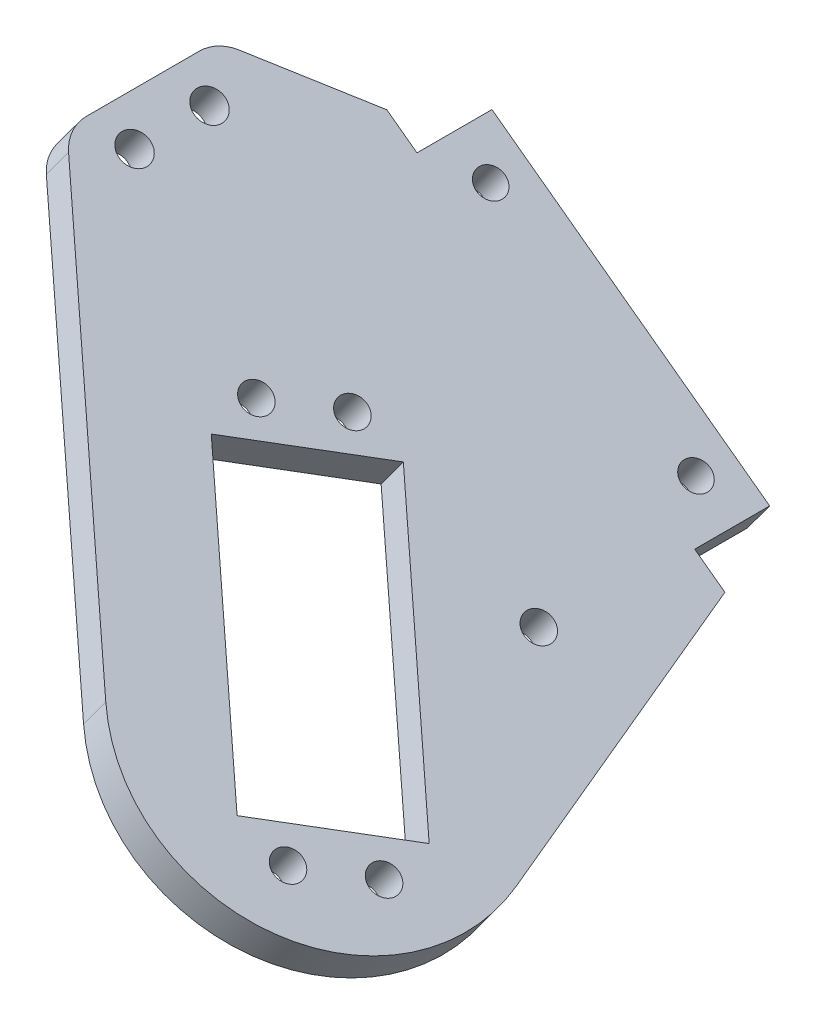
ISO-10303-21;
HEADER;
FILE_DESCRIPTION(('STEP AP214'),'2;1');
FILE_NAME('part.step','',(''),(''),'','','');
FILE_SCHEMA(('AUTOMOTIVE_DESIGN { 1 0 10303 214 1 1 1 1 }'));
ENDSEC;
DATA;
#1=APPLICATION_CONTEXT('core data for automotive mechanical design processes');
#2=APPLICATION_PROTOCOL_DEFINITION('international standard','automotive_design',2000,#1);
#3=PRODUCT_CONTEXT('',#1,'mechanical');
#4=PRODUCT('Part','Part','',(#3));
#5=PRODUCT_RELATED_PRODUCT_CATEGORY('part','',(#4));
#6=PRODUCT_DEFINITION_FORMATION('','',#4);
#7=PRODUCT_DEFINITION_CONTEXT('part definition',#1,'design');
#8=PRODUCT_DEFINITION('design','',#6,#7);
#9=PRODUCT_DEFINITION_SHAPE('','',#8);
#10=(LENGTH_UNIT() NAMED_UNIT(*) SI_UNIT(.MILLI.,.METRE.));
#11=(NAMED_UNIT(*) PLANE_ANGLE_UNIT() SI_UNIT($,.RADIAN.));
#12=(NAMED_UNIT(*) SI_UNIT($,.STERADIAN.) SOLID_ANGLE_UNIT());
#13=UNCERTAINTY_MEASURE_WITH_UNIT(LENGTH_MEASURE(1.E-05),#10,'distance_accuracy_value','');
#14=(GEOMETRIC_REPRESENTATION_CONTEXT(3) GLOBAL_UNCERTAINTY_ASSIGNED_CONTEXT((#13)) GLOBAL_UNIT_ASSIGNED_CONTEXT((#10,
#11,#12)) REPRESENTATION_CONTEXT('',''));
#15=CARTESIAN_POINT('',(0.,0.,0.));
#16=DIRECTION('',(0.,0.,1.));
#17=DIRECTION('',(1.,0.,0.));
#18=AXIS2_PLACEMENT_3D('',#15,#16,#17);
#19=CARTESIAN_POINT('',(-2.56826288802433,-38.4615240936028,78.4668397417343));
#20=DIRECTION('',(-0.592700679914284,-0.805422810720646,0.));
#21=DIRECTION('',(0.805422810720646,-0.592700679914284,0.));
#22=AXIS2_PLACEMENT_3D('',#19,#20,#21);
#23=PLANE('',#22);
#24=DIRECTION('',(-0.659763741918804,0.485511973603262,-0.573576436351044));
#25=VECTOR('',#24,1.);
#26=CARTESIAN_POINT('',(8.64908998645359,-46.7162352677162,76.0110836623548));
#27=LINE('',#26,#25);
#28=CARTESIAN_POINT('',(8.6490899864536,-46.7162352677162,76.0110836623548));
#29=VERTEX_POINT('',#28);
#30=CARTESIAN_POINT('',(-17.7414596902985,-27.2957563235857,53.068026208313));
#31=VERTEX_POINT('',#30);
#32=EDGE_CURVE('E610',#29,#31,#27,.T.);
#33=ORIENTED_EDGE('',*,*,#32,.F.);
#34=DIRECTION('',(-0.46197154552899,0.339959143808076,0.819152044288993));
#35=VECTOR('',#34,1.);
#36=CARTESIAN_POINT('',(8.6490899864536,-46.7162352677162,76.0110836623548));
#37=LINE('',#36,#35);
#38=CARTESIAN_POINT('',(-0.590340924126197,-39.9170523915547,92.3941245481346));
#39=VERTEX_POINT('',#38);
#40=EDGE_CURVE('E595',#29,#39,#37,.T.);
#41=ORIENTED_EDGE('',*,*,#40,.T.);
#42=DIRECTION('',(-0.659763741918804,0.485511973603262,-0.573576436351044));
#43=VECTOR('',#42,1.);
#44=CARTESIAN_POINT('',(-0.590340924126197,-39.9170523915547,92.3941245481346));
#45=LINE('',#44,#43);
#46=CARTESIAN_POINT('',(-26.9808906008784,-20.4965734474242,69.4510670940929));
#47=VERTEX_POINT('',#46);
#48=EDGE_CURVE('E602',#39,#47,#45,.T.);
#49=ORIENTED_EDGE('',*,*,#48,.T.);
#50=DIRECTION('',(-0.46197154552899,0.339959143808076,0.819152044288993));
#51=VECTOR('',#50,1.);
#52=CARTESIAN_POINT('',(-17.7414596902986,-27.2957563235857,53.068026208313));
#53=LINE('',#52,#51);
#54=EDGE_CURVE('E604',#31,#47,#53,.T.);
#55=ORIENTED_EDGE('',*,*,#54,.F.);
#56=EDGE_LOOP('',(#33,#41,#49,#55));
#57=FACE_BOUND('',#56,.T.);
#58=CARTESIAN_POINT('',(-48.8933107770378,-4.37149458933134,45.1017152651327));
#59=DIRECTION('',(0.592700679914284,0.805422810720646,0.));
#60=DIRECTION('',(-0.805422810720646,0.592700679914284,0.));
#61=AXIS2_PLACEMENT_3D('',#58,#59,#60);
#62=CIRCLE('',#61,5.);
#63=CARTESIAN_POINT('',(-52.9204248306411,-1.40799118975992,45.1017152651327));
#64=VERTEX_POINT('',#63);
#65=CARTESIAN_POINT('',(-51.4818897934885,-2.46659132282289,41.2714930495378));
#66=VERTEX_POINT('',#65);
#67=EDGE_CURVE('E135',#64,#66,#62,.F.);
#68=ORIENTED_EDGE('',*,*,#67,.F.);
#69=DIRECTION('',(0.,0.,1.));
#70=VECTOR('',#69,1.);
#71=CARTESIAN_POINT('',(-52.9204248306411,-1.40799118975993,42.7701769743577));
#72=LINE('',#71,#70);
#73=CARTESIAN_POINT('',(-52.9204248306411,-1.40799118975994,60.167341721599));
#74=VERTEX_POINT('',#73);
#75=EDGE_CURVE('E127',#64,#74,#72,.T.);
#76=ORIENTED_EDGE('',*,*,#75,.T.);
#77=CARTESIAN_POINT('',(-48.8933107770378,-4.37149458933136,60.167341721599));
#78=DIRECTION('',(0.592700679914283,0.805422810720646,0.));
#79=DIRECTION('',(-0.805422810720646,0.592700679914283,0.));
#80=AXIS2_PLACEMENT_3D('',#77,#78,#79);
#81=CIRCLE('',#80,5.);
#82=CARTESIAN_POINT('',(-51.2031685046828,-2.67169887029098,64.2631019430439));
#83=VERTEX_POINT('',#82);
#84=EDGE_CURVE('E242',#83,#74,#81,.F.);
#85=ORIENTED_EDGE('',*,*,#84,.F.);
#86=DIRECTION('',(0.659763741918804,-0.485511973603262,0.573576436351044));
#87=VECTOR('',#86,1.);
#88=CARTESIAN_POINT('',(-51.2031685046828,-2.67169887029099,64.2631019430439));
#89=LINE('',#88,#87);
#90=CARTESIAN_POINT('',(-13.1936084351911,-30.6424637860171,97.3073367603811));
#91=VERTEX_POINT('',#90);
#92=EDGE_CURVE('E163',#83,#91,#89,.T.);
#93=ORIENTED_EDGE('',*,*,#92,.T.);
#94=CARTESIAN_POINT('',(-2.56826288802433,-38.4615240936028,78.4668397417343));
#95=DIRECTION('',(0.592700679914284,0.805422810720646,0.));
#96=DIRECTION('',(-0.805422810720646,0.592700679914284,0.));
#97=AXIS2_PLACEMENT_3D('',#94,#95,#96);
#98=CIRCLE('',#97,23.);
#99=CARTESIAN_POINT('',(14.839284164453,-51.2715225643584,70.600376445244));
#100=VERTEX_POINT('',#99);
#101=EDGE_CURVE('E171',#100,#91,#98,.F.);
#102=ORIENTED_EDGE('',*,*,#101,.F.);
#103=DIRECTION('',(0.275470825160435,-0.202715571493502,0.93969262078591));
#104=VECTOR('',#103,1.);
#105=CARTESIAN_POINT('',(3.28906660296383,-42.771860386021,31.2));
#106=LINE('',#105,#104);
#107=CARTESIAN_POINT('',(3.28906660296384,-42.771860386021,31.2));
#108=VERTEX_POINT('',#107);
#109=EDGE_CURVE('E168',#100,#108,#106,.F.);
#110=ORIENTED_EDGE('',*,*,#109,.T.);
#111=DIRECTION('',(-0.805422810720647,0.592700679914283,0.));
#112=VECTOR('',#111,1.);
#113=CARTESIAN_POINT('',(3.28906660296386,-42.771860386021,31.2));
#114=LINE('',#113,#112);
#115=CARTESIAN_POINT('',(-0.738047450639377,-39.8083569864496,31.2));
#116=VERTEX_POINT('',#115);
#117=EDGE_CURVE('E175',#108,#116,#114,.T.);
#118=ORIENTED_EDGE('',*,*,#117,.T.);
#119=DIRECTION('',(0.,0.,1.));
#120=VECTOR('',#119,1.);
#121=CARTESIAN_POINT('',(-0.73804745063938,-39.8083569864496,31.2));
#122=LINE('',#121,#120);
#123=CARTESIAN_POINT('',(-0.738047450639381,-39.8083569864496,21.2000000000001));
#124=VERTEX_POINT('',#123);
#125=EDGE_CURVE('E181',#116,#124,#122,.F.);
#126=ORIENTED_EDGE('',*,*,#125,.T.);
#127=DIRECTION('',(-0.805422810720646,0.592700679914284,0.));
#128=VECTOR('',#127,1.);
#129=CARTESIAN_POINT('',(-0.738047450639375,-39.8083569864496,21.2000000000001));
#130=LINE('',#129,#128);
#131=CARTESIAN_POINT('',(-37.7874967437891,-12.5441257103925,21.2000000000001));
#132=VERTEX_POINT('',#131);
#133=EDGE_CURVE('E187',#124,#132,#130,.T.);
#134=ORIENTED_EDGE('',*,*,#133,.T.);
#135=DIRECTION('',(0.,0.,1.));
#136=VECTOR('',#135,1.);
#137=CARTESIAN_POINT('',(-37.7874967437891,-12.5441257103925,21.2000000000001));
#138=LINE('',#137,#136);
#139=CARTESIAN_POINT('',(-37.7874967437891,-12.5441257103925,31.2));
#140=VERTEX_POINT('',#139);
#141=EDGE_CURVE('E193',#132,#140,#138,.T.);
#142=ORIENTED_EDGE('',*,*,#141,.T.);
#143=DIRECTION('',(-0.805422810720646,0.592700679914283,0.));
#144=VECTOR('',#143,1.);
#145=CARTESIAN_POINT('',(-37.7874967437891,-12.5441257103925,31.2));
#146=LINE('',#145,#144);
#147=CARTESIAN_POINT('',(-41.8146107973923,-9.5806223108211,31.2));
#148=VERTEX_POINT('',#147);
#149=EDGE_CURVE('E138',#140,#148,#146,.T.);
#150=ORIENTED_EDGE('',*,*,#149,.T.);
#151=DIRECTION('',(-0.616989668513819,0.454035062281176,0.642787609686541));
#152=VECTOR('',#151,1.);
#153=CARTESIAN_POINT('',(-41.8146107973923,-9.5806223108211,31.2));
#154=LINE('',#153,#152);
#155=EDGE_CURVE('E132',#148,#66,#154,.T.);
#156=ORIENTED_EDGE('',*,*,#155,.T.);
#157=EDGE_LOOP('',(#68,#76,#85,#93,#102,#110,#118,#126,#134,#142,#150,#156));
#158=FACE_BOUND('',#157,.T.);
#159=CARTESIAN_POINT('',(4.6884536421534,-43.8016519918097,90.8794582902694));
#160=DIRECTION('',(-0.592700679914284,-0.805422810720646,0.));
#161=DIRECTION('',(0.805422810720646,-0.592700679914284,0.));
#162=AXIS2_PLACEMENT_3D('',#159,#160,#161);
#163=CIRCLE('',#162,1.94999999999999);
#164=CARTESIAN_POINT('',(6.25902812305865,-44.9574183176426,90.8794582902694));
#165=VERTEX_POINT('',#164);
#166=EDGE_CURVE('E162',#165,#165,#163,.T.);
#167=ORIENTED_EDGE('',*,*,#166,.T.);
#168=EDGE_LOOP('',(#167));
#169=FACE_BOUND('',#168,.T.);
#170=CARTESIAN_POINT('',(9.30816909744329,-47.2012434298905,82.6879378473795));
#171=DIRECTION('',(-0.592700679914284,-0.805422810720646,0.));
#172=DIRECTION('',(0.805422810720646,-0.592700679914284,0.));
#173=AXIS2_PLACEMENT_3D('',#170,#171,#172);
#174=CIRCLE('',#173,1.95);
#175=CARTESIAN_POINT('',(10.8787435783486,-48.3570097557233,82.6879378473795));
#176=VERTEX_POINT('',#175);
#177=EDGE_CURVE('E250',#176,#176,#174,.T.);
#178=ORIENTED_EDGE('',*,*,#177,.T.);
#179=EDGE_LOOP('',(#178));
#180=FACE_BOUND('',#179,.T.);
#181=CARTESIAN_POINT('',(-27.639969711868,-20.0115652852499,62.7742129090682));
#182=DIRECTION('',(-0.592700679914284,-0.805422810720646,0.));
#183=DIRECTION('',(0.805422810720646,-0.592700679914284,0.));
#184=AXIS2_PLACEMENT_3D('',#181,#182,#183);
#185=CIRCLE('',#184,1.95);
#186=CARTESIAN_POINT('',(-26.0693952309628,-21.1673316110827,62.7742129090682));
#187=VERTEX_POINT('',#186);
#188=EDGE_CURVE('E253',#187,#187,#185,.T.);
#189=ORIENTED_EDGE('',*,*,#188,.T.);
#190=EDGE_LOOP('',(#189));
#191=FACE_BOUND('',#190,.T.);
#192=CARTESIAN_POINT('',(-23.0202542565781,-23.4111567233306,54.5826924661783));
#193=DIRECTION('',(-0.592700679914284,-0.805422810720646,0.));
#194=DIRECTION('',(0.805422810720646,-0.592700679914284,0.));
#195=AXIS2_PLACEMENT_3D('',#192,#193,#194);
#196=CIRCLE('',#195,1.95);
#197=CARTESIAN_POINT('',(-21.4496797756729,-24.5669230491635,54.5826924661783));
#198=VERTEX_POINT('',#197);
#199=EDGE_CURVE('E256',#198,#198,#196,.T.);
#200=ORIENTED_EDGE('',*,*,#199,.T.);
#201=EDGE_LOOP('',(#200));
#202=FACE_BOUND('',#201,.T.);
#203=CARTESIAN_POINT('',(-1.54347026136005,-39.2156563065353,51.2));
#204=DIRECTION('',(-0.592700679914284,-0.805422810720646,0.));
#205=DIRECTION('',(0.805422810720646,-0.592700679914284,0.));
#206=AXIS2_PLACEMENT_3D('',#203,#204,#205);
#207=CIRCLE('',#206,1.95);
#208=CARTESIAN_POINT('',(0.0271042195452162,-40.3714226323681,51.2));
#209=VERTEX_POINT('',#208);
#210=EDGE_CURVE('E259',#209,#209,#207,.T.);
#211=ORIENTED_EDGE('',*,*,#210,.T.);
#212=EDGE_LOOP('',(#211));
#213=FACE_BOUND('',#212,.T.);
#214=CARTESIAN_POINT('',(-48.8933107770379,-4.37149458933136,57.7701769743577));
#215=DIRECTION('',(-0.592700679914284,-0.805422810720646,0.));
#216=DIRECTION('',(0.805422810720646,-0.592700679914284,0.));
#217=AXIS2_PLACEMENT_3D('',#214,#215,#216);
#218=CIRCLE('',#217,2.04873855011629);
#219=CARTESIAN_POINT('',(-47.2432100155715,-5.58578332095189,57.7701769743577));
#220=VERTEX_POINT('',#219);
#221=EDGE_CURVE('E262',#220,#220,#218,.T.);
#222=ORIENTED_EDGE('',*,*,#221,.T.);
#223=EDGE_LOOP('',(#222));
#224=FACE_BOUND('',#223,.T.);
#225=CARTESIAN_POINT('',(-48.8933107770379,-4.37149458933135,47.7701769743577));
#226=DIRECTION('',(-0.592700679914284,-0.805422810720646,0.));
#227=DIRECTION('',(0.805422810720646,-0.592700679914284,0.));
#228=AXIS2_PLACEMENT_3D('',#225,#226,#227);
#229=CIRCLE('',#228,2.04873855011629);
#230=CARTESIAN_POINT('',(-47.2432100155715,-5.58578332095188,47.7701769743577));
#231=VERTEX_POINT('',#230);
#232=EDGE_CURVE('E265',#231,#231,#229,.T.);
#233=ORIENTED_EDGE('',*,*,#232,.T.);
#234=EDGE_LOOP('',(#233));
#235=FACE_BOUND('',#234,.T.);
#236=CARTESIAN_POINT('',(-32.9549598794652,-16.1003297898782,26.2000000000001));
#237=DIRECTION('',(-0.592700679914284,-0.805422810720646,0.));
#238=DIRECTION('',(0.805422810720646,-0.592700679914284,0.));
#239=AXIS2_PLACEMENT_3D('',#236,#237,#238);
#240=CIRCLE('',#239,1.89999999999999);
#241=CARTESIAN_POINT('',(-31.424656539096,-17.2264610817154,26.2000000000001));
#242=VERTEX_POINT('',#241);
#243=EDGE_CURVE('E267',#242,#242,#240,.T.);
#244=ORIENTED_EDGE('',*,*,#243,.T.);
#245=EDGE_LOOP('',(#244));
#246=FACE_BOUND('',#245,.T.);
#247=CARTESIAN_POINT('',(-5.57058431496323,-36.2521529069639,26.2));
#248=DIRECTION('',(-0.592700679914284,-0.805422810720646,0.));
#249=DIRECTION('',(0.805422810720646,-0.592700679914284,0.));
#250=AXIS2_PLACEMENT_3D('',#247,#248,#249);
#251=CIRCLE('',#250,1.9);
#252=CARTESIAN_POINT('',(-4.040280974594,-37.378284198801,26.2));
#253=VERTEX_POINT('',#252);
#254=EDGE_CURVE('E20',#253,#253,#251,.T.);
#255=ORIENTED_EDGE('',*,*,#254,.T.);
#256=EDGE_LOOP('',(#255));
#257=FACE_BOUND('',#256,.T.);
#258=ADVANCED_FACE('F17',(#57,#158,#169,#180,#191,#202,#213,#224,#235,#246,#257),#23,.F.);
#259=CARTESIAN_POINT('',(-4.38518295513467,-34.6413072855226,26.2));
#260=DIRECTION('',(-0.592700679914284,-0.805422810720646,0.));
#261=DIRECTION('',(0.805422810720646,-0.592700679914284,0.));
#262=AXIS2_PLACEMENT_3D('',#259,#260,#261);
#263=CYLINDRICAL_SURFACE('',#262,1.9);
#264=CARTESIAN_POINT('',(-8.53408771453465,-40.2792669605671,26.2));
#265=DIRECTION('',(-0.592700679914284,-0.805422810720646,0.));
#266=DIRECTION('',(0.805422810720646,-0.592700679914284,0.));
#267=AXIS2_PLACEMENT_3D('',#264,#265,#266);
#268=CIRCLE('',#267,1.9);
#269=CARTESIAN_POINT('',(-7.00378437416543,-41.4053982524042,26.2));
#270=VERTEX_POINT('',#269);
#271=EDGE_CURVE('E239',#270,#270,#268,.F.);
#272=ORIENTED_EDGE('',*,*,#271,.F.);
#273=EDGE_LOOP('',(#272));
#274=FACE_BOUND('',#273,.T.);
#275=ORIENTED_EDGE('',*,*,#254,.F.);
#276=EDGE_LOOP('',(#275));
#277=FACE_BOUND('',#276,.T.);
#278=ADVANCED_FACE('F275',(#274,#277),#263,.F.);
#279=CARTESIAN_POINT('',(-31.7695585196366,-14.4894841684369,26.2000000000001));
#280=DIRECTION('',(-0.592700679914284,-0.805422810720646,0.));
#281=DIRECTION('',(0.805422810720646,-0.592700679914284,0.));
#282=AXIS2_PLACEMENT_3D('',#279,#280,#281);
#283=CYLINDRICAL_SURFACE('',#282,1.89999999999999);
#284=CARTESIAN_POINT('',(-35.9184632790366,-20.1274438434815,26.2000000000001));
#285=DIRECTION('',(-0.592700679914284,-0.805422810720646,0.));
#286=DIRECTION('',(0.805422810720646,-0.592700679914284,0.));
#287=AXIS2_PLACEMENT_3D('',#284,#285,#286);
#288=CIRCLE('',#287,1.89999999999999);
#289=CARTESIAN_POINT('',(-34.3881599386674,-21.2535751353186,26.2000000000001));
#290=VERTEX_POINT('',#289);
#291=EDGE_CURVE('E236',#290,#290,#288,.F.);
#292=ORIENTED_EDGE('',*,*,#291,.F.);
#293=EDGE_LOOP('',(#292));
#294=FACE_BOUND('',#293,.T.);
#295=ORIENTED_EDGE('',*,*,#243,.F.);
#296=EDGE_LOOP('',(#295));
#297=FACE_BOUND('',#296,.T.);
#298=ADVANCED_FACE('F277',(#294,#297),#283,.F.);
#299=CARTESIAN_POINT('',(-45.9298073774664,-0.344380535728123,47.7701769743577));
#300=DIRECTION('',(-0.592700679914284,-0.805422810720646,0.));
#301=DIRECTION('',(0.805422810720646,-0.592700679914284,0.));
#302=AXIS2_PLACEMENT_3D('',#299,#300,#301);
#303=CYLINDRICAL_SURFACE('',#302,2.04873855011629);
#304=CARTESIAN_POINT('',(-51.8568141766093,-8.39860864293458,47.7701769743577));
#305=DIRECTION('',(-0.592700679914284,-0.805422810720646,0.));
#306=DIRECTION('',(0.805422810720646,-0.592700679914284,0.));
#307=AXIS2_PLACEMENT_3D('',#304,#305,#306);
#308=CIRCLE('',#307,2.04873855011629);
#309=CARTESIAN_POINT('',(-50.2067134151429,-9.61289737455511,47.7701769743577));
#310=VERTEX_POINT('',#309);
#311=EDGE_CURVE('E233',#310,#310,#308,.F.);
#312=ORIENTED_EDGE('',*,*,#311,.F.);
#313=EDGE_LOOP('',(#312));
#314=FACE_BOUND('',#313,.T.);
#315=ORIENTED_EDGE('',*,*,#232,.F.);
#316=EDGE_LOOP('',(#315));
#317=FACE_BOUND('',#316,.T.);
#318=ADVANCED_FACE('F284',(#314,#317),#303,.F.);
#319=CARTESIAN_POINT('',(-45.9298073774664,-0.344380535728134,57.7701769743577));
#320=DIRECTION('',(-0.592700679914284,-0.805422810720646,0.));
#321=DIRECTION('',(0.805422810720646,-0.592700679914284,0.));
#322=AXIS2_PLACEMENT_3D('',#319,#320,#321);
#323=CYLINDRICAL_SURFACE('',#322,2.04873855011629);
#324=CARTESIAN_POINT('',(-51.8568141766093,-8.39860864293459,57.7701769743577));
#325=DIRECTION('',(-0.592700679914284,-0.805422810720646,0.));
#326=DIRECTION('',(0.805422810720646,-0.592700679914284,0.));
#327=AXIS2_PLACEMENT_3D('',#324,#325,#326);
#328=CIRCLE('',#327,2.04873855011629);
#329=CARTESIAN_POINT('',(-50.2067134151429,-9.61289737455512,57.7701769743577));
#330=VERTEX_POINT('',#329);
#331=EDGE_CURVE('E230',#330,#330,#328,.F.);
#332=ORIENTED_EDGE('',*,*,#331,.F.);
#333=EDGE_LOOP('',(#332));
#334=FACE_BOUND('',#333,.T.);
#335=ORIENTED_EDGE('',*,*,#221,.F.);
#336=EDGE_LOOP('',(#335));
#337=FACE_BOUND('',#336,.T.);
#338=ADVANCED_FACE('F375',(#334,#337),#323,.F.);
#339=CARTESIAN_POINT('',(1.42003313821137,-35.188542252932,51.2));
#340=DIRECTION('',(-0.592700679914284,-0.805422810720646,0.));
#341=DIRECTION('',(0.805422810720646,-0.592700679914284,0.));
#342=AXIS2_PLACEMENT_3D('',#339,#340,#341);
#343=CYLINDRICAL_SURFACE('',#342,1.95);
#344=CARTESIAN_POINT('',(-4.50697366093147,-43.2427703601385,51.2));
#345=DIRECTION('',(-0.592700679914284,-0.805422810720646,0.));
#346=DIRECTION('',(0.805422810720646,-0.592700679914284,0.));
#347=AXIS2_PLACEMENT_3D('',#344,#345,#346);
#348=CIRCLE('',#347,1.95);
#349=CARTESIAN_POINT('',(-2.93639918002621,-44.3985366859714,51.2));
#350=VERTEX_POINT('',#349);
#351=EDGE_CURVE('E227',#350,#350,#348,.F.);
#352=ORIENTED_EDGE('',*,*,#351,.F.);
#353=EDGE_LOOP('',(#352));
#354=FACE_BOUND('',#353,.T.);
#355=ORIENTED_EDGE('',*,*,#210,.F.);
#356=EDGE_LOOP('',(#355));
#357=FACE_BOUND('',#356,.T.);
#358=ADVANCED_FACE('F371',(#354,#357),#343,.F.);
#359=CARTESIAN_POINT('',(-20.0567508570067,-19.3840426697274,54.5826924661783));
#360=DIRECTION('',(-0.592700679914284,-0.805422810720646,0.));
#361=DIRECTION('',(0.805422810720646,-0.592700679914284,0.));
#362=AXIS2_PLACEMENT_3D('',#359,#360,#361);
#363=CYLINDRICAL_SURFACE('',#362,1.95);
#364=CARTESIAN_POINT('',(-25.9837576561495,-27.4382707769339,54.5826924661783));
#365=DIRECTION('',(-0.592700679914284,-0.805422810720646,0.));
#366=DIRECTION('',(0.805422810720646,-0.592700679914284,0.));
#367=AXIS2_PLACEMENT_3D('',#364,#365,#366);
#368=CIRCLE('',#367,1.95);
#369=CARTESIAN_POINT('',(-24.4131831752443,-28.5940371027667,54.5826924661783));
#370=VERTEX_POINT('',#369);
#371=EDGE_CURVE('E224',#370,#370,#368,.F.);
#372=ORIENTED_EDGE('',*,*,#371,.F.);
#373=EDGE_LOOP('',(#372));
#374=FACE_BOUND('',#373,.T.);
#375=ORIENTED_EDGE('',*,*,#199,.F.);
#376=EDGE_LOOP('',(#375));
#377=FACE_BOUND('',#376,.T.);
#378=ADVANCED_FACE('F367',(#374,#377),#363,.F.);
#379=CARTESIAN_POINT('',(-24.6764663122966,-15.9844512316467,62.7742129090682));
#380=DIRECTION('',(-0.592700679914284,-0.805422810720646,0.));
#381=DIRECTION('',(0.805422810720646,-0.592700679914284,0.));
#382=AXIS2_PLACEMENT_3D('',#379,#380,#381);
#383=CYLINDRICAL_SURFACE('',#382,1.95);
#384=CARTESIAN_POINT('',(-30.6034731114395,-24.0386793388531,62.7742129090682));
#385=DIRECTION('',(-0.592700679914284,-0.805422810720646,0.));
#386=DIRECTION('',(0.805422810720646,-0.592700679914284,0.));
#387=AXIS2_PLACEMENT_3D('',#384,#385,#386);
#388=CIRCLE('',#387,1.95);
#389=CARTESIAN_POINT('',(-29.0328986305342,-25.194445664686,62.7742129090682));
#390=VERTEX_POINT('',#389);
#391=EDGE_CURVE('E221',#390,#390,#388,.F.);
#392=ORIENTED_EDGE('',*,*,#391,.F.);
#393=EDGE_LOOP('',(#392));
#394=FACE_BOUND('',#393,.T.);
#395=ORIENTED_EDGE('',*,*,#188,.F.);
#396=EDGE_LOOP('',(#395));
#397=FACE_BOUND('',#396,.T.);
#398=ADVANCED_FACE('F363',(#394,#397),#383,.F.);
#399=CARTESIAN_POINT('',(12.2716724970147,-43.1741293762873,82.6879378473795));
#400=DIRECTION('',(-0.592700679914284,-0.805422810720646,0.));
#401=DIRECTION('',(0.805422810720646,-0.592700679914284,0.));
#402=AXIS2_PLACEMENT_3D('',#399,#400,#401);
#403=CYLINDRICAL_SURFACE('',#402,1.95);
#404=CARTESIAN_POINT('',(6.34466569787186,-51.2283574834937,82.6879378473795));
#405=DIRECTION('',(-0.592700679914284,-0.805422810720646,0.));
#406=DIRECTION('',(0.805422810720646,-0.592700679914284,0.));
#407=AXIS2_PLACEMENT_3D('',#404,#405,#406);
#408=CIRCLE('',#407,1.95);
#409=CARTESIAN_POINT('',(7.91524017877713,-52.3841238093266,82.6879378473795));
#410=VERTEX_POINT('',#409);
#411=EDGE_CURVE('E218',#410,#410,#408,.F.);
#412=ORIENTED_EDGE('',*,*,#411,.F.);
#413=EDGE_LOOP('',(#412));
#414=FACE_BOUND('',#413,.T.);
#415=ORIENTED_EDGE('',*,*,#177,.F.);
#416=EDGE_LOOP('',(#415));
#417=FACE_BOUND('',#416,.T.);
#418=ADVANCED_FACE('F359',(#414,#417),#403,.F.);
#419=CARTESIAN_POINT('',(7.6519570417248,-39.7745379382065,90.8794582902694));
#420=DIRECTION('',(-0.592700679914284,-0.805422810720646,0.));
#421=DIRECTION('',(0.805422810720646,-0.592700679914284,0.));
#422=AXIS2_PLACEMENT_3D('',#419,#420,#421);
#423=CYLINDRICAL_SURFACE('',#422,1.94999999999999);
#424=CARTESIAN_POINT('',(1.72495024258197,-47.828766045413,90.8794582902694));
#425=DIRECTION('',(-0.592700679914284,-0.805422810720646,0.));
#426=DIRECTION('',(0.805422810720646,-0.592700679914284,0.));
#427=AXIS2_PLACEMENT_3D('',#424,#425,#426);
#428=CIRCLE('',#427,1.94999999999999);
#429=CARTESIAN_POINT('',(3.29552472348723,-48.9845323712458,90.8794582902694));
#430=VERTEX_POINT('',#429);
#431=EDGE_CURVE('E215',#430,#430,#428,.F.);
#432=ORIENTED_EDGE('',*,*,#431,.F.);
#433=EDGE_LOOP('',(#432));
#434=FACE_BOUND('',#433,.T.);
#435=ORIENTED_EDGE('',*,*,#166,.F.);
#436=EDGE_LOOP('',(#435));
#437=FACE_BOUND('',#436,.T.);
#438=ADVANCED_FACE('F356',(#434,#437),#423,.F.);
#439=CARTESIAN_POINT('',(-55.8839282302125,-5.43510524336316,42.7701769743577));
#440=DIRECTION('',(0.805422810720646,-0.592700679914284,0.));
#441=DIRECTION('',(0.592700679914284,0.805422810720646,0.));
#442=AXIS2_PLACEMENT_3D('',#439,#440,#441);
#443=PLANE('',#442);
#444=DIRECTION('',(0.592700679914284,0.805422810720646,0.));
#445=VECTOR('',#444,1.);
#446=CARTESIAN_POINT('',(-55.8839282302125,-5.43510524336317,45.1017152651327));
#447=LINE('',#446,#445);
#448=CARTESIAN_POINT('',(-55.8839282302125,-5.43510524336316,45.1017152651327));
#449=VERTEX_POINT('',#448);
#450=EDGE_CURVE('E148',#449,#64,#447,.T.);
#451=ORIENTED_EDGE('',*,*,#450,.F.);
#452=DIRECTION('',(0.,0.,1.));
#453=VECTOR('',#452,1.);
#454=CARTESIAN_POINT('',(-55.8839282302125,-5.43510524336318,78.4668397417343));
#455=LINE('',#454,#453);
#456=CARTESIAN_POINT('',(-55.8839282302125,-5.43510524336317,60.167341721599));
#457=VERTEX_POINT('',#456);
#458=EDGE_CURVE('E214',#457,#449,#455,.F.);
#459=ORIENTED_EDGE('',*,*,#458,.F.);
#460=DIRECTION('',(0.592700679914283,0.805422810720646,0.));
#461=VECTOR('',#460,1.);
#462=CARTESIAN_POINT('',(-55.8839282302125,-5.43510524336318,60.167341721599));
#463=LINE('',#462,#461);
#464=EDGE_CURVE('E245',#74,#457,#463,.F.);
#465=ORIENTED_EDGE('',*,*,#464,.F.);
#466=ORIENTED_EDGE('',*,*,#75,.F.);
#467=EDGE_LOOP('',(#451,#459,#465,#466));
#468=FACE_BOUND('',#467,.T.);
#469=ADVANCED_FACE('F353',(#468),#443,.F.);
#470=CARTESIAN_POINT('',(-51.8568141766093,-8.39860864293458,45.1017152651327));
#471=DIRECTION('',(0.592700679914284,0.805422810720646,0.));
#472=DIRECTION('',(-0.805422810720646,0.592700679914284,0.));
#473=AXIS2_PLACEMENT_3D('',#470,#471,#472);
#474=CYLINDRICAL_SURFACE('',#473,5.);
#475=ORIENTED_EDGE('',*,*,#67,.T.);
#476=DIRECTION('',(-0.592700679914284,-0.805422810720646,0.));
#477=VECTOR('',#476,1.);
#478=CARTESIAN_POINT('',(-51.4818897934885,-2.4665913228229,41.2714930495378));
#479=LINE('',#478,#477);
#480=CARTESIAN_POINT('',(-54.44539319306,-6.49370537642613,41.2714930495378));
#481=VERTEX_POINT('',#480);
#482=EDGE_CURVE('E142',#66,#481,#479,.T.);
#483=ORIENTED_EDGE('',*,*,#482,.T.);
#484=CARTESIAN_POINT('',(-51.8568141766093,-8.39860864293458,45.1017152651327));
#485=DIRECTION('',(0.592700679914284,0.805422810720646,0.));
#486=DIRECTION('',(-0.805422810720646,0.592700679914284,0.));
#487=AXIS2_PLACEMENT_3D('',#484,#485,#486);
#488=CIRCLE('',#487,5.);
#489=EDGE_CURVE('E212',#449,#481,#488,.F.);
#490=ORIENTED_EDGE('',*,*,#489,.F.);
#491=ORIENTED_EDGE('',*,*,#450,.T.);
#492=EDGE_LOOP('',(#475,#483,#490,#491));
#493=FACE_BOUND('',#492,.T.);
#494=ADVANCED_FACE('F145',(#493),#474,.T.);
#495=CARTESIAN_POINT('',(-44.7781141969637,-13.6077363644243,31.2));
#496=DIRECTION('',(0.517715803290139,-0.38098065330169,0.766044443118977));
#497=DIRECTION('',(0.828529656168727,0.,-0.559945183789388));
#498=AXIS2_PLACEMENT_3D('',#495,#496,#497);
#499=PLANE('',#498);
#500=ORIENTED_EDGE('',*,*,#482,.F.);
#501=ORIENTED_EDGE('',*,*,#155,.F.);
#502=DIRECTION('',(-0.592700679914283,-0.805422810720646,0.));
#503=VECTOR('',#502,1.);
#504=CARTESIAN_POINT('',(-41.8146107973923,-9.5806223108211,31.2));
#505=LINE('',#504,#503);
#506=CARTESIAN_POINT('',(-44.7781141969638,-13.6077363644243,31.2));
#507=VERTEX_POINT('',#506);
#508=EDGE_CURVE('E154',#148,#507,#505,.T.);
#509=ORIENTED_EDGE('',*,*,#508,.T.);
#510=DIRECTION('',(0.616989668513818,-0.454035062281176,-0.642787609686541));
#511=VECTOR('',#510,1.);
#512=CARTESIAN_POINT('',(-54.44539319306,-6.49370537642613,41.2714930495378));
#513=LINE('',#512,#511);
#514=EDGE_CURVE('E152',#481,#507,#513,.T.);
#515=ORIENTED_EDGE('',*,*,#514,.F.);
#516=EDGE_LOOP('',(#500,#501,#509,#515));
#517=FACE_BOUND('',#516,.T.);
#518=ADVANCED_FACE('F150',(#517),#499,.F.);
#519=CARTESIAN_POINT('',(-40.7510001433605,-16.5712397639957,31.2));
#520=DIRECTION('',(0.,0.,1.));
#521=DIRECTION('',(0.,-1.,0.));
#522=AXIS2_PLACEMENT_3D('',#519,#520,#521);
#523=PLANE('',#522);
#524=DIRECTION('',(0.592700679914284,0.805422810720646,0.));
#525=VECTOR('',#524,1.);
#526=CARTESIAN_POINT('',(-40.7510001433605,-16.5712397639957,31.2));
#527=LINE('',#526,#525);
#528=CARTESIAN_POINT('',(-40.7510001433605,-16.5712397639957,31.1999999999999));
#529=VERTEX_POINT('',#528);
#530=EDGE_CURVE('E195',#140,#529,#527,.F.);
#531=ORIENTED_EDGE('',*,*,#530,.T.);
#532=DIRECTION('',(0.805422810720646,-0.592700679914284,0.));
#533=VECTOR('',#532,1.);
#534=CARTESIAN_POINT('',(-5.53176628759573,-42.488638147206,31.1999999999999));
#535=LINE('',#534,#533);
#536=EDGE_CURVE('E648',#507,#529,#535,.T.);
#537=ORIENTED_EDGE('',*,*,#536,.F.);
#538=ORIENTED_EDGE('',*,*,#508,.F.);
#539=ORIENTED_EDGE('',*,*,#149,.F.);
#540=EDGE_LOOP('',(#531,#537,#538,#539));
#541=FACE_BOUND('',#540,.T.);
#542=ADVANCED_FACE('F344',(#541),#523,.F.);
#543=CARTESIAN_POINT('',(-40.7510001433605,-16.5712397639957,21.2000000000001));
#544=DIRECTION('',(0.805422810720646,-0.592700679914284,0.));
#545=DIRECTION('',(0.592700679914284,0.805422810720646,0.));
#546=AXIS2_PLACEMENT_3D('',#543,#544,#545);
#547=PLANE('',#546);
#548=DIRECTION('',(-0.592700679914283,-0.805422810720646,0.));
#549=VECTOR('',#548,1.);
#550=CARTESIAN_POINT('',(-37.7874967437891,-12.5441257103925,21.2000000000001));
#551=LINE('',#550,#549);
#552=CARTESIAN_POINT('',(-40.7510001433605,-16.5712397639957,21.2));
#553=VERTEX_POINT('',#552);
#554=EDGE_CURVE('E190',#132,#553,#551,.T.);
#555=ORIENTED_EDGE('',*,*,#554,.T.);
#556=DIRECTION('',(0.,0.,1.));
#557=VECTOR('',#556,1.);
#558=CARTESIAN_POINT('',(-40.7510001433605,-16.5712397639958,78.4668397417343));
#559=LINE('',#558,#557);
#560=EDGE_CURVE('E640',#529,#553,#559,.F.);
#561=ORIENTED_EDGE('',*,*,#560,.F.);
#562=ORIENTED_EDGE('',*,*,#530,.F.);
#563=ORIENTED_EDGE('',*,*,#141,.F.);
#564=EDGE_LOOP('',(#555,#561,#562,#563));
#565=FACE_BOUND('',#564,.T.);
#566=ADVANCED_FACE('F340',(#565),#547,.F.);
#567=CARTESIAN_POINT('',(-3.70155085021079,-43.8354710400528,21.2000000000001));
#568=DIRECTION('',(0.,0.,1.));
#569=DIRECTION('',(0.,-1.,0.));
#570=AXIS2_PLACEMENT_3D('',#567,#568,#569);
#571=PLANE('',#570);
#572=DIRECTION('',(-0.592700679914284,-0.805422810720646,0.));
#573=VECTOR('',#572,1.);
#574=CARTESIAN_POINT('',(-3.7015508502108,-43.8354710400528,21.2000000000001));
#575=LINE('',#574,#573);
#576=CARTESIAN_POINT('',(-3.70155085021079,-43.8354710400528,21.2));
#577=VERTEX_POINT('',#576);
#578=EDGE_CURVE('E184',#124,#577,#575,.T.);
#579=ORIENTED_EDGE('',*,*,#578,.T.);
#580=DIRECTION('',(0.805422810720646,-0.592700679914284,0.));
#581=VECTOR('',#580,1.);
#582=CARTESIAN_POINT('',(-5.53176628759573,-42.488638147206,21.2));
#583=LINE('',#582,#581);
#584=EDGE_CURVE('E632',#553,#577,#583,.T.);
#585=ORIENTED_EDGE('',*,*,#584,.F.);
#586=ORIENTED_EDGE('',*,*,#554,.F.);
#587=ORIENTED_EDGE('',*,*,#133,.F.);
#588=EDGE_LOOP('',(#579,#585,#586,#587));
#589=FACE_BOUND('',#588,.T.);
#590=ADVANCED_FACE('F336',(#589),#571,.F.);
#591=CARTESIAN_POINT('',(-3.70155085021079,-43.8354710400528,31.2));
#592=DIRECTION('',(-0.805422810720646,0.592700679914284,0.));
#593=DIRECTION('',(-0.592700679914284,-0.805422810720646,0.));
#594=AXIS2_PLACEMENT_3D('',#591,#592,#593);
#595=PLANE('',#594);
#596=DIRECTION('',(-0.592700679914284,-0.805422810720646,0.));
#597=VECTOR('',#596,1.);
#598=CARTESIAN_POINT('',(-0.738047450639375,-39.8083569864496,31.2));
#599=LINE('',#598,#597);
#600=CARTESIAN_POINT('',(-3.7015508502108,-43.8354710400528,31.1999999999999));
#601=VERTEX_POINT('',#600);
#602=EDGE_CURVE('E178',#116,#601,#599,.T.);
#603=ORIENTED_EDGE('',*,*,#602,.T.);
#604=DIRECTION('',(0.,0.,1.));
#605=VECTOR('',#604,1.);
#606=CARTESIAN_POINT('',(-3.70155085021082,-43.8354710400528,78.4668397417343));
#607=LINE('',#606,#605);
#608=EDGE_CURVE('E624',#577,#601,#607,.T.);
#609=ORIENTED_EDGE('',*,*,#608,.F.);
#610=ORIENTED_EDGE('',*,*,#578,.F.);
#611=ORIENTED_EDGE('',*,*,#125,.F.);
#612=EDGE_LOOP('',(#603,#609,#610,#611));
#613=FACE_BOUND('',#612,.T.);
#614=ADVANCED_FACE('F332',(#613),#595,.F.);
#615=CARTESIAN_POINT('',(-3.70155085021079,-43.8354710400528,31.2));
#616=DIRECTION('',(0.,0.,1.));
#617=DIRECTION('',(0.,-1.,0.));
#618=AXIS2_PLACEMENT_3D('',#615,#616,#617);
#619=PLANE('',#618);
#620=DIRECTION('',(-0.592700679914283,-0.805422810720646,0.));
#621=VECTOR('',#620,1.);
#622=CARTESIAN_POINT('',(0.325563203392439,-46.7989744396242,31.2));
#623=LINE('',#622,#621);
#624=CARTESIAN_POINT('',(0.325563203392438,-46.7989744396242,31.1999999999999));
#625=VERTEX_POINT('',#624);
#626=EDGE_CURVE('E172',#108,#625,#623,.T.);
#627=ORIENTED_EDGE('',*,*,#626,.T.);
#628=DIRECTION('',(0.805422810720646,-0.592700679914284,0.));
#629=VECTOR('',#628,1.);
#630=CARTESIAN_POINT('',(-5.53176628759573,-42.488638147206,31.1999999999999));
#631=LINE('',#630,#629);
#632=EDGE_CURVE('E621',#601,#625,#631,.T.);
#633=ORIENTED_EDGE('',*,*,#632,.F.);
#634=ORIENTED_EDGE('',*,*,#602,.F.);
#635=ORIENTED_EDGE('',*,*,#117,.F.);
#636=EDGE_LOOP('',(#627,#633,#634,#635));
#637=FACE_BOUND('',#636,.T.);
#638=ADVANCED_FACE('F328',(#637),#619,.F.);
#639=CARTESIAN_POINT('',(0.325563203392438,-46.7989744396242,31.2));
#640=DIRECTION('',(-0.756849871846838,0.556956455250244,0.342020143325665));
#641=DIRECTION('',(-0.592700679914283,-0.805422810720646,0.));
#642=AXIS2_PLACEMENT_3D('',#639,#640,#641);
#643=PLANE('',#642);
#644=DIRECTION('',(0.592700679914284,0.805422810720646,0.));
#645=VECTOR('',#644,1.);
#646=CARTESIAN_POINT('',(11.8757807648815,-55.2986366179617,70.600376445244));
#647=LINE('',#646,#645);
#648=CARTESIAN_POINT('',(11.8757807648815,-55.2986366179617,70.600376445244));
#649=VERTEX_POINT('',#648);
#650=EDGE_CURVE('E246',#649,#100,#647,.T.);
#651=ORIENTED_EDGE('',*,*,#650,.F.);
#652=DIRECTION('',(0.275470825160435,-0.202715571493503,0.93969262078591));
#653=VECTOR('',#652,1.);
#654=CARTESIAN_POINT('',(0.325563203392437,-46.7989744396242,31.1999999999999));
#655=LINE('',#654,#653);
#656=EDGE_CURVE('E211',#625,#649,#655,.T.);
#657=ORIENTED_EDGE('',*,*,#656,.F.);
#658=ORIENTED_EDGE('',*,*,#626,.F.);
#659=ORIENTED_EDGE('',*,*,#109,.F.);
#660=EDGE_LOOP('',(#651,#657,#658,#659));
#661=FACE_BOUND('',#660,.T.);
#662=ADVANCED_FACE('F324',(#661),#643,.F.);
#663=CARTESIAN_POINT('',(-5.53176628759575,-42.488638147206,78.4668397417343));
#664=DIRECTION('',(0.592700679914284,0.805422810720646,0.));
#665=DIRECTION('',(-0.805422810720646,0.592700679914284,0.));
#666=AXIS2_PLACEMENT_3D('',#663,#664,#665);
#667=CYLINDRICAL_SURFACE('',#666,23.);
#668=CARTESIAN_POINT('',(-5.53176628759575,-42.488638147206,78.4668397417343));
#669=DIRECTION('',(0.592700679914284,0.805422810720646,0.));
#670=DIRECTION('',(-0.805422810720646,0.592700679914284,0.));
#671=AXIS2_PLACEMENT_3D('',#668,#669,#670);
#672=CIRCLE('',#671,23.);
#673=CARTESIAN_POINT('',(-16.1571118347625,-34.6695778396203,97.3073367603811));
#674=VERTEX_POINT('',#673);
#675=EDGE_CURVE('E208',#649,#674,#672,.F.);
#676=ORIENTED_EDGE('',*,*,#675,.F.);
#677=ORIENTED_EDGE('',*,*,#650,.T.);
#678=ORIENTED_EDGE('',*,*,#101,.T.);
#679=DIRECTION('',(-0.592700679914284,-0.805422810720646,0.));
#680=VECTOR('',#679,1.);
#681=CARTESIAN_POINT('',(-13.1936084351911,-30.6424637860171,97.3073367603811));
#682=LINE('',#681,#680);
#683=EDGE_CURVE('E167',#91,#674,#682,.T.);
#684=ORIENTED_EDGE('',*,*,#683,.T.);
#685=EDGE_LOOP('',(#676,#677,#678,#684));
#686=FACE_BOUND('',#685,.T.);
#687=ADVANCED_FACE('F320',(#686),#667,.T.);
#688=CARTESIAN_POINT('',(-55.8839282302125,-5.43510524336318,62.7701769743577));
#689=DIRECTION('',(0.46197154552899,-0.339959143808075,-0.819152044288993));
#690=DIRECTION('',(-0.871030437983872,0.,-0.491229046479973));
#691=AXIS2_PLACEMENT_3D('',#688,#689,#690);
#692=PLANE('',#691);
#693=DIRECTION('',(0.592700679914283,0.805422810720646,0.));
#694=VECTOR('',#693,1.);
#695=CARTESIAN_POINT('',(-54.1666719042542,-6.69881292389421,64.2631019430439));
#696=LINE('',#695,#694);
#697=CARTESIAN_POINT('',(-54.1666719042542,-6.69881292389421,64.2631019430439));
#698=VERTEX_POINT('',#697);
#699=EDGE_CURVE('E166',#698,#83,#696,.T.);
#700=ORIENTED_EDGE('',*,*,#699,.F.);
#701=DIRECTION('',(-0.659763741918804,0.485511973603262,-0.573576436351045));
#702=VECTOR('',#701,1.);
#703=CARTESIAN_POINT('',(-16.1571118347625,-34.6695778396203,97.3073367603811));
#704=LINE('',#703,#702);
#705=EDGE_CURVE('E207',#674,#698,#704,.T.);
#706=ORIENTED_EDGE('',*,*,#705,.F.);
#707=ORIENTED_EDGE('',*,*,#683,.F.);
#708=ORIENTED_EDGE('',*,*,#92,.F.);
#709=EDGE_LOOP('',(#700,#706,#707,#708));
#710=FACE_BOUND('',#709,.T.);
#711=ADVANCED_FACE('F316',(#710),#692,.F.);
#712=CARTESIAN_POINT('',(-51.8568141766093,-8.3986086429346,60.167341721599));
#713=DIRECTION('',(0.592700679914283,0.805422810720646,0.));
#714=DIRECTION('',(-0.805422810720646,0.592700679914283,0.));
#715=AXIS2_PLACEMENT_3D('',#712,#713,#714);
#716=CYLINDRICAL_SURFACE('',#715,5.);
#717=ORIENTED_EDGE('',*,*,#84,.T.);
#718=ORIENTED_EDGE('',*,*,#464,.T.);
#719=CARTESIAN_POINT('',(-51.8568141766093,-8.3986086429346,60.167341721599));
#720=DIRECTION('',(0.592700679914283,0.805422810720646,0.));
#721=DIRECTION('',(-0.805422810720646,0.592700679914283,0.));
#722=AXIS2_PLACEMENT_3D('',#719,#720,#721);
#723=CIRCLE('',#722,5.);
#724=EDGE_CURVE('E203',#698,#457,#723,.F.);
#725=ORIENTED_EDGE('',*,*,#724,.F.);
#726=ORIENTED_EDGE('',*,*,#699,.T.);
#727=EDGE_LOOP('',(#717,#718,#725,#726));
#728=FACE_BOUND('',#727,.T.);
#729=ADVANCED_FACE('F312',(#728),#716,.T.);
#730=CARTESIAN_POINT('',(-23.6684664894414,-35.3499844307922,53.068026208313));
#731=DIRECTION('',(-0.46197154552899,0.339959143808075,0.819152044288993));
#732=DIRECTION('',(0.871030437983872,0.,0.491229046479973));
#733=AXIS2_PLACEMENT_3D('',#730,#731,#732);
#734=PLANE('',#733);
#735=DIRECTION('',(0.592700679914282,0.805422810720647,0.));
#736=VECTOR('',#735,1.);
#737=CARTESIAN_POINT('',(-20.70496308987,-31.3228703771889,53.068026208313));
#738=LINE('',#737,#736);
#739=CARTESIAN_POINT('',(-20.70496308987,-31.3228703771889,53.068026208313));
#740=VERTEX_POINT('',#739);
#741=EDGE_CURVE('E607',#740,#31,#738,.T.);
#742=ORIENTED_EDGE('',*,*,#741,.F.);
#743=DIRECTION('',(-0.659763741918804,0.485511973603262,-0.573576436351044));
#744=VECTOR('',#743,1.);
#745=CARTESIAN_POINT('',(5.6855865868822,-50.7433493213194,76.0110836623548));
#746=LINE('',#745,#744);
#747=CARTESIAN_POINT('',(5.68558658688219,-50.7433493213194,76.0110836623548));
#748=VERTEX_POINT('',#747);
#749=EDGE_CURVE('E206',#748,#740,#746,.T.);
#750=ORIENTED_EDGE('',*,*,#749,.F.);
#751=DIRECTION('',(0.592700679914283,0.805422810720647,0.));
#752=VECTOR('',#751,1.);
#753=CARTESIAN_POINT('',(5.6855865868822,-50.7433493213194,76.0110836623548));
#754=LINE('',#753,#752);
#755=EDGE_CURVE('E597',#748,#29,#754,.T.);
#756=ORIENTED_EDGE('',*,*,#755,.T.);
#757=ORIENTED_EDGE('',*,*,#32,.T.);
#758=EDGE_LOOP('',(#742,#750,#756,#757));
#759=FACE_BOUND('',#758,.T.);
#760=ADVANCED_FACE('F308',(#759),#734,.T.);
#761=CARTESIAN_POINT('',(-32.9078974000212,-28.5508015546307,69.4510670940929));
#762=DIRECTION('',(0.659763741918804,-0.485511973603262,0.573576436351044));
#763=DIRECTION('',(0.656093276223915,0.,-0.754679808192699));
#764=AXIS2_PLACEMENT_3D('',#761,#762,#763);
#765=PLANE('',#764);
#766=DIRECTION('',(-0.592700679914282,-0.805422810720647,0.));
#767=VECTOR('',#766,1.);
#768=CARTESIAN_POINT('',(-26.9808906008784,-20.4965734474242,69.4510670940929));
#769=LINE('',#768,#767);
#770=CARTESIAN_POINT('',(-29.9443940004498,-24.5236875010274,69.4510670940929));
#771=VERTEX_POINT('',#770);
#772=EDGE_CURVE('E600',#47,#771,#769,.T.);
#773=ORIENTED_EDGE('',*,*,#772,.T.);
#774=DIRECTION('',(-0.461971545528991,0.339959143808075,0.819152044288993));
#775=VECTOR('',#774,1.);
#776=CARTESIAN_POINT('',(-20.70496308987,-31.3228703771889,53.068026208313));
#777=LINE('',#776,#775);
#778=EDGE_CURVE('E666',#740,#771,#777,.T.);
#779=ORIENTED_EDGE('',*,*,#778,.F.);
#780=ORIENTED_EDGE('',*,*,#741,.T.);
#781=ORIENTED_EDGE('',*,*,#54,.T.);
#782=EDGE_LOOP('',(#773,#779,#780,#781));
#783=FACE_BOUND('',#782,.T.);
#784=ADVANCED_FACE('F305',(#783),#765,.T.);
#785=CARTESIAN_POINT('',(-32.9078974000212,-28.5508015546307,69.4510670940929));
#786=DIRECTION('',(-0.46197154552899,0.339959143808075,0.819152044288993));
#787=DIRECTION('',(0.871030437983872,0.,0.491229046479973));
#788=AXIS2_PLACEMENT_3D('',#785,#786,#787);
#789=PLANE('',#788);
#790=ORIENTED_EDGE('',*,*,#772,.F.);
#791=ORIENTED_EDGE('',*,*,#48,.F.);
#792=DIRECTION('',(-0.592700679914284,-0.805422810720646,0.));
#793=VECTOR('',#792,1.);
#794=CARTESIAN_POINT('',(-0.590340924126207,-39.9170523915547,92.3941245481346));
#795=LINE('',#794,#793);
#796=CARTESIAN_POINT('',(-3.55384432369761,-43.9441664451579,92.3941245481346));
#797=VERTEX_POINT('',#796);
#798=EDGE_CURVE('E35',#39,#797,#795,.T.);
#799=ORIENTED_EDGE('',*,*,#798,.T.);
#800=DIRECTION('',(0.659763741918804,-0.485511973603262,0.573576436351044));
#801=VECTOR('',#800,1.);
#802=CARTESIAN_POINT('',(-29.9443940004498,-24.5236875010274,69.4510670940929));
#803=LINE('',#802,#801);
#804=EDGE_CURVE('E26',#771,#797,#803,.T.);
#805=ORIENTED_EDGE('',*,*,#804,.F.);
#806=EDGE_LOOP('',(#790,#791,#799,#805));
#807=FACE_BOUND('',#806,.T.);
#808=ADVANCED_FACE('F297',(#807),#789,.F.);
#809=CARTESIAN_POINT('',(-6.51734772326904,-47.9712804987611,92.3941245481346));
#810=DIRECTION('',(0.659763741918804,-0.485511973603262,0.573576436351045));
#811=DIRECTION('',(0.656093276223916,0.,-0.754679808192699));
#812=AXIS2_PLACEMENT_3D('',#809,#810,#811);
#813=PLANE('',#812);
#814=ORIENTED_EDGE('',*,*,#798,.F.);
#815=ORIENTED_EDGE('',*,*,#40,.F.);
#816=ORIENTED_EDGE('',*,*,#755,.F.);
#817=DIRECTION('',(0.46197154552899,-0.339959143808075,-0.819152044288993));
#818=VECTOR('',#817,1.);
#819=CARTESIAN_POINT('',(-3.55384432369761,-43.9441664451579,92.3941245481346));
#820=LINE('',#819,#818);
#821=EDGE_CURVE('E11',#797,#748,#820,.T.);
#822=ORIENTED_EDGE('',*,*,#821,.F.);
#823=EDGE_LOOP('',(#814,#815,#816,#822));
#824=FACE_BOUND('',#823,.T.);
#825=ADVANCED_FACE('F291',(#824),#813,.F.);
#826=CARTESIAN_POINT('',(-5.53176628759575,-42.488638147206,78.4668397417343));
#827=DIRECTION('',(-0.592700679914284,-0.805422810720646,0.));
#828=DIRECTION('',(0.805422810720646,-0.592700679914284,0.));
#829=AXIS2_PLACEMENT_3D('',#826,#827,#828);
#830=PLANE('',#829);
#831=ORIENTED_EDGE('',*,*,#804,.T.);
#832=ORIENTED_EDGE('',*,*,#821,.T.);
#833=ORIENTED_EDGE('',*,*,#749,.T.);
#834=ORIENTED_EDGE('',*,*,#778,.T.);
#835=EDGE_LOOP('',(#831,#832,#833,#834));
#836=FACE_BOUND('',#835,.T.);
#837=ORIENTED_EDGE('',*,*,#705,.T.);
#838=ORIENTED_EDGE('',*,*,#724,.T.);
#839=ORIENTED_EDGE('',*,*,#458,.T.);
#840=ORIENTED_EDGE('',*,*,#489,.T.);
#841=ORIENTED_EDGE('',*,*,#514,.T.);
#842=ORIENTED_EDGE('',*,*,#536,.T.);
#843=ORIENTED_EDGE('',*,*,#560,.T.);
#844=ORIENTED_EDGE('',*,*,#584,.T.);
#845=ORIENTED_EDGE('',*,*,#608,.T.);
#846=ORIENTED_EDGE('',*,*,#632,.T.);
#847=ORIENTED_EDGE('',*,*,#656,.T.);
#848=ORIENTED_EDGE('',*,*,#675,.T.);
#849=EDGE_LOOP('',(#837,#838,#839,#840,#841,#842,#843,#844,#845,#846,#847,#848));
#850=FACE_BOUND('',#849,.T.);
#851=ORIENTED_EDGE('',*,*,#431,.T.);
#852=EDGE_LOOP('',(#851));
#853=FACE_BOUND('',#852,.T.);
#854=ORIENTED_EDGE('',*,*,#411,.T.);
#855=EDGE_LOOP('',(#854));
#856=FACE_BOUND('',#855,.T.);
#857=ORIENTED_EDGE('',*,*,#391,.T.);
#858=EDGE_LOOP('',(#857));
#859=FACE_BOUND('',#858,.T.);
#860=ORIENTED_EDGE('',*,*,#371,.T.);
#861=EDGE_LOOP('',(#860));
#862=FACE_BOUND('',#861,.T.);
#863=ORIENTED_EDGE('',*,*,#351,.T.);
#864=EDGE_LOOP('',(#863));
#865=FACE_BOUND('',#864,.T.);
#866=ORIENTED_EDGE('',*,*,#331,.T.);
#867=EDGE_LOOP('',(#866));
#868=FACE_BOUND('',#867,.T.);
#869=ORIENTED_EDGE('',*,*,#311,.T.);
#870=EDGE_LOOP('',(#869));
#871=FACE_BOUND('',#870,.T.);
#872=ORIENTED_EDGE('',*,*,#291,.T.);
#873=EDGE_LOOP('',(#872));
#874=FACE_BOUND('',#873,.T.);
#875=ORIENTED_EDGE('',*,*,#271,.T.);
#876=EDGE_LOOP('',(#875));
#877=FACE_BOUND('',#876,.T.);
#878=ADVANCED_FACE('F289',(#836,#850,#853,#856,#859,#862,#865,#868,#871,#874,#877),#830,.T.);
#879=CLOSED_SHELL('',(#258,#278,#298,#318,#338,#358,#378,#398,#418,#438,#469,#494,#518,#542,
#566,#590,#614,#638,#662,#687,#711,#729,#760,#784,#808,#825,#878));
#880=MANIFOLD_SOLID_BREP('B1',#879);
#881=ADVANCED_BREP_SHAPE_REPRESENTATION('',(#18,#880),#14);
#882=SHAPE_DEFINITION_REPRESENTATION(#9,#881);
ENDSEC;
END-ISO-10303-21;
